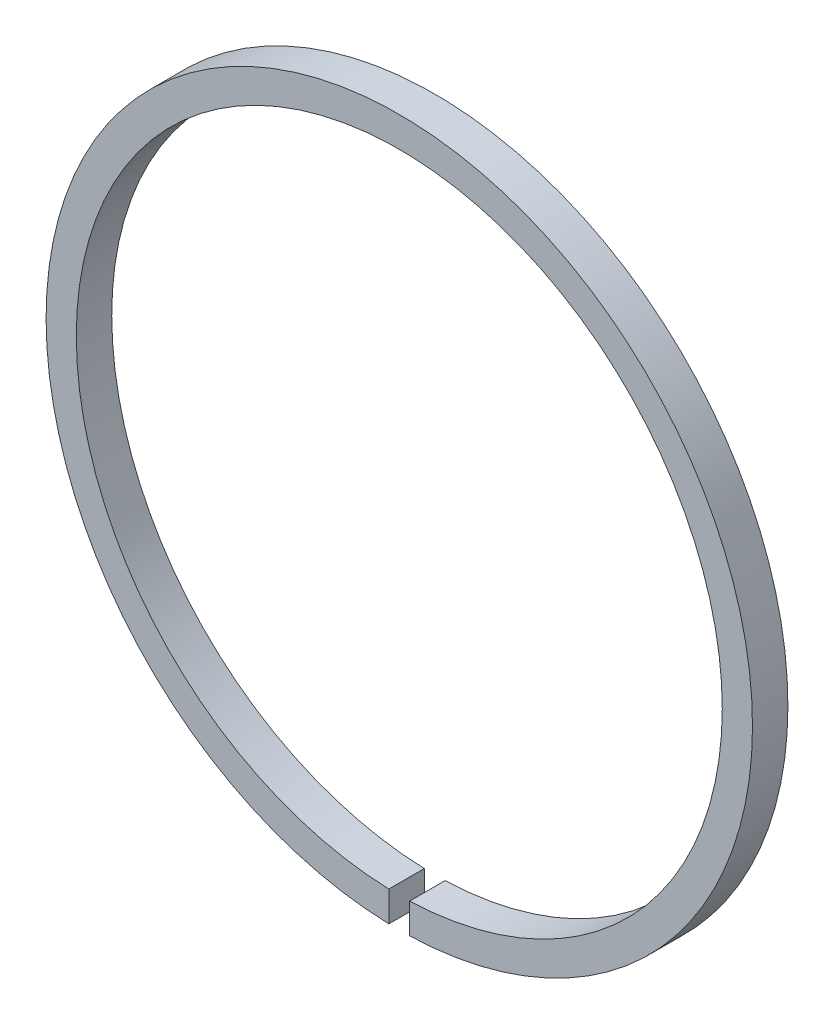
ISO-10303-21;
HEADER;
FILE_DESCRIPTION(('STEP AP214'),'2;1');
FILE_NAME('part.step','',(''),(''),'','','');
FILE_SCHEMA(('AUTOMOTIVE_DESIGN { 1 0 10303 214 1 1 1 1 }'));
ENDSEC;
DATA;
#1=APPLICATION_CONTEXT('core data for automotive mechanical design processes');
#2=APPLICATION_PROTOCOL_DEFINITION('international standard','automotive_design',2000,#1);
#3=PRODUCT_CONTEXT('',#1,'mechanical');
#4=PRODUCT('Part','Part','',(#3));
#5=PRODUCT_RELATED_PRODUCT_CATEGORY('part','',(#4));
#6=PRODUCT_DEFINITION_FORMATION('','',#4);
#7=PRODUCT_DEFINITION_CONTEXT('part definition',#1,'design');
#8=PRODUCT_DEFINITION('design','',#6,#7);
#9=PRODUCT_DEFINITION_SHAPE('','',#8);
#10=(LENGTH_UNIT() NAMED_UNIT(*) SI_UNIT(.MILLI.,.METRE.));
#11=(NAMED_UNIT(*) PLANE_ANGLE_UNIT() SI_UNIT($,.RADIAN.));
#12=(NAMED_UNIT(*) SI_UNIT($,.STERADIAN.) SOLID_ANGLE_UNIT());
#13=UNCERTAINTY_MEASURE_WITH_UNIT(LENGTH_MEASURE(1.E-05),#10,'distance_accuracy_value','');
#14=(GEOMETRIC_REPRESENTATION_CONTEXT(3) GLOBAL_UNCERTAINTY_ASSIGNED_CONTEXT((#13)) GLOBAL_UNIT_ASSIGNED_CONTEXT((#10,
#11,#12)) REPRESENTATION_CONTEXT('',''));
#15=CARTESIAN_POINT('',(0.,0.,0.));
#16=DIRECTION('',(0.,0.,1.));
#17=DIRECTION('',(1.,0.,0.));
#18=AXIS2_PLACEMENT_3D('',#15,#16,#17);
#19=CARTESIAN_POINT('',(0.,0.,4.318));
#20=DIRECTION('',(0.,0.,1.));
#21=DIRECTION('',(1.,0.,0.));
#22=AXIS2_PLACEMENT_3D('',#19,#20,#21);
#23=PLANE('',#22);
#24=CARTESIAN_POINT('',(0.,0.,4.318));
#25=DIRECTION('',(0.,0.,1.));
#26=DIRECTION('',(1.,0.,0.));
#27=AXIS2_PLACEMENT_3D('',#24,#25,#26);
#28=CIRCLE('',#27,43.053);
#29=CARTESIAN_POINT('',(1.27000000000001,-43.034264359926,4.318));
#30=VERTEX_POINT('',#29);
#31=CARTESIAN_POINT('',(-1.26999999999999,-43.034264359926,4.318));
#32=VERTEX_POINT('',#31);
#33=EDGE_CURVE('E11',#30,#32,#28,.T.);
#34=ORIENTED_EDGE('',*,*,#33,.T.);
#35=DIRECTION('',(0.,-1.,0.));
#36=VECTOR('',#35,1.);
#37=CARTESIAN_POINT('',(-1.26999999999999,-39.3495107974674,4.318));
#38=LINE('',#37,#36);
#39=CARTESIAN_POINT('',(-1.26999999999999,-39.3495107974674,4.318));
#40=VERTEX_POINT('',#39);
#41=EDGE_CURVE('E75',#40,#32,#38,.T.);
#42=ORIENTED_EDGE('',*,*,#41,.F.);
#43=CARTESIAN_POINT('',(0.,0.,4.318));
#44=DIRECTION('',(0.,0.,1.));
#45=DIRECTION('',(1.,0.,0.));
#46=AXIS2_PLACEMENT_3D('',#43,#44,#45);
#47=CIRCLE('',#46,39.37);
#48=CARTESIAN_POINT('',(1.27000000000013,-39.3495107974674,4.318));
#49=VERTEX_POINT('',#48);
#50=EDGE_CURVE('E85',#49,#40,#47,.T.);
#51=ORIENTED_EDGE('',*,*,#50,.F.);
#52=DIRECTION('',(0.,1.,0.));
#53=VECTOR('',#52,1.);
#54=CARTESIAN_POINT('',(1.27000000000001,-39.3495107974674,4.318));
#55=LINE('',#54,#53);
#56=EDGE_CURVE('E57',#30,#49,#55,.T.);
#57=ORIENTED_EDGE('',*,*,#56,.F.);
#58=EDGE_LOOP('',(#34,#42,#51,#57));
#59=FACE_BOUND('',#58,.T.);
#60=ADVANCED_FACE('F34',(#59),#23,.T.);
#61=CARTESIAN_POINT('',(0.,0.,0.));
#62=DIRECTION('',(0.,0.,1.));
#63=DIRECTION('',(1.,0.,0.));
#64=AXIS2_PLACEMENT_3D('',#61,#62,#63);
#65=PLANE('',#64);
#66=DIRECTION('',(0.,-1.,0.));
#67=VECTOR('',#66,1.);
#68=CARTESIAN_POINT('',(-1.26999999999999,-39.3495107974674,0.));
#69=LINE('',#68,#67);
#70=CARTESIAN_POINT('',(-1.26999999999999,-39.3495107974674,0.));
#71=VERTEX_POINT('',#70);
#72=CARTESIAN_POINT('',(-1.26999999999999,-43.034264359926,0.));
#73=VERTEX_POINT('',#72);
#74=EDGE_CURVE('E49',#71,#73,#69,.T.);
#75=ORIENTED_EDGE('',*,*,#74,.T.);
#76=CARTESIAN_POINT('',(0.,0.,0.));
#77=DIRECTION('',(0.,0.,1.));
#78=DIRECTION('',(1.,0.,0.));
#79=AXIS2_PLACEMENT_3D('',#76,#77,#78);
#80=CIRCLE('',#79,43.053);
#81=CARTESIAN_POINT('',(1.27000000000001,-43.034264359926,0.));
#82=VERTEX_POINT('',#81);
#83=EDGE_CURVE('E38',#82,#73,#80,.T.);
#84=ORIENTED_EDGE('',*,*,#83,.F.);
#85=DIRECTION('',(0.,1.,0.));
#86=VECTOR('',#85,1.);
#87=CARTESIAN_POINT('',(1.27000000000001,-39.3495107974674,0.));
#88=LINE('',#87,#86);
#89=CARTESIAN_POINT('',(1.27000000000001,-39.3495107974674,0.));
#90=VERTEX_POINT('',#89);
#91=EDGE_CURVE('E87',#82,#90,#88,.T.);
#92=ORIENTED_EDGE('',*,*,#91,.T.);
#93=CARTESIAN_POINT('',(0.,0.,0.));
#94=DIRECTION('',(0.,0.,1.));
#95=DIRECTION('',(1.,0.,0.));
#96=AXIS2_PLACEMENT_3D('',#93,#94,#95);
#97=CIRCLE('',#96,39.37);
#98=EDGE_CURVE('E90',#90,#71,#97,.T.);
#99=ORIENTED_EDGE('',*,*,#98,.T.);
#100=EDGE_LOOP('',(#75,#84,#92,#99));
#101=FACE_BOUND('',#100,.T.);
#102=ADVANCED_FACE('F105',(#101),#65,.F.);
#103=CARTESIAN_POINT('',(0.,0.,4.318));
#104=DIRECTION('',(0.,0.,-1.));
#105=DIRECTION('',(-1.,0.,0.));
#106=AXIS2_PLACEMENT_3D('',#103,#104,#105);
#107=CYLINDRICAL_SURFACE('',#106,43.053);
#108=DIRECTION('',(0.,0.,-1.));
#109=VECTOR('',#108,1.);
#110=CARTESIAN_POINT('',(-1.26999999999999,-43.034264359926,4.318));
#111=LINE('',#110,#109);
#112=EDGE_CURVE('E93',#32,#73,#111,.T.);
#113=ORIENTED_EDGE('',*,*,#112,.F.);
#114=ORIENTED_EDGE('',*,*,#33,.F.);
#115=DIRECTION('',(0.,0.,-1.));
#116=VECTOR('',#115,1.);
#117=CARTESIAN_POINT('',(1.27000000000001,-43.034264359926,4.318));
#118=LINE('',#117,#116);
#119=EDGE_CURVE('E97',#82,#30,#118,.F.);
#120=ORIENTED_EDGE('',*,*,#119,.F.);
#121=ORIENTED_EDGE('',*,*,#83,.T.);
#122=EDGE_LOOP('',(#113,#114,#120,#121));
#123=FACE_BOUND('',#122,.T.);
#124=ADVANCED_FACE('F36',(#123),#107,.T.);
#125=CARTESIAN_POINT('',(0.,0.,4.318));
#126=DIRECTION('',(0.,0.,-1.));
#127=DIRECTION('',(-1.,0.,0.));
#128=AXIS2_PLACEMENT_3D('',#125,#126,#127);
#129=CYLINDRICAL_SURFACE('',#128,39.37);
#130=ORIENTED_EDGE('',*,*,#50,.T.);
#131=DIRECTION('',(0.,0.,-1.));
#132=VECTOR('',#131,1.);
#133=CARTESIAN_POINT('',(-1.26999999999999,-39.3495107974674,4.318));
#134=LINE('',#133,#132);
#135=EDGE_CURVE('E72',#40,#71,#134,.T.);
#136=ORIENTED_EDGE('',*,*,#135,.T.);
#137=ORIENTED_EDGE('',*,*,#98,.F.);
#138=DIRECTION('',(0.,0.,-1.));
#139=VECTOR('',#138,1.);
#140=CARTESIAN_POINT('',(1.27000000000001,-39.3495107974674,4.318));
#141=LINE('',#140,#139);
#142=EDGE_CURVE('E81',#49,#90,#141,.T.);
#143=ORIENTED_EDGE('',*,*,#142,.F.);
#144=EDGE_LOOP('',(#130,#136,#137,#143));
#145=FACE_BOUND('',#144,.T.);
#146=ADVANCED_FACE('F89',(#145),#129,.F.);
#147=CARTESIAN_POINT('',(1.27000000000001,-39.3495107974674,4.318));
#148=DIRECTION('',(-1.,0.,0.));
#149=DIRECTION('',(0.,0.,1.));
#150=AXIS2_PLACEMENT_3D('',#147,#148,#149);
#151=PLANE('',#150);
#152=ORIENTED_EDGE('',*,*,#119,.T.);
#153=ORIENTED_EDGE('',*,*,#56,.T.);
#154=ORIENTED_EDGE('',*,*,#142,.T.);
#155=ORIENTED_EDGE('',*,*,#91,.F.);
#156=EDGE_LOOP('',(#152,#153,#154,#155));
#157=FACE_BOUND('',#156,.T.);
#158=ADVANCED_FACE('F108',(#157),#151,.T.);
#159=CARTESIAN_POINT('',(-1.26999999999999,-39.3495107974674,4.318));
#160=DIRECTION('',(1.,0.,0.));
#161=DIRECTION('',(0.,0.,-1.));
#162=AXIS2_PLACEMENT_3D('',#159,#160,#161);
#163=PLANE('',#162);
#164=ORIENTED_EDGE('',*,*,#112,.T.);
#165=ORIENTED_EDGE('',*,*,#74,.F.);
#166=ORIENTED_EDGE('',*,*,#135,.F.);
#167=ORIENTED_EDGE('',*,*,#41,.T.);
#168=EDGE_LOOP('',(#164,#165,#166,#167));
#169=FACE_BOUND('',#168,.T.);
#170=ADVANCED_FACE('F74',(#169),#163,.T.);
#171=CLOSED_SHELL('',(#60,#102,#124,#146,#158,#170));
#172=MANIFOLD_SOLID_BREP('B2',#171);
#173=ADVANCED_BREP_SHAPE_REPRESENTATION('',(#18,#172),#14);
#174=SHAPE_DEFINITION_REPRESENTATION(#9,#173);
ENDSEC;
END-ISO-10303-21;
